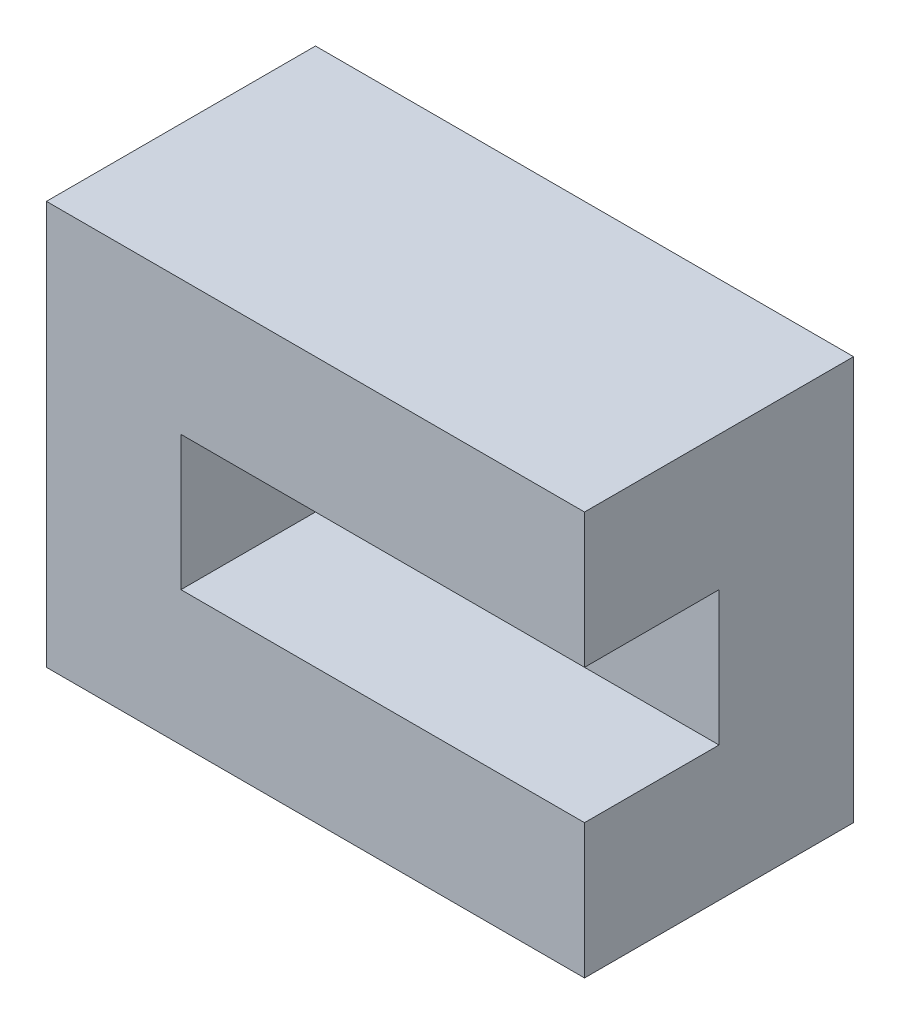
ISO-10303-21;
HEADER;
FILE_DESCRIPTION(('STEP AP214'),'2;1');
FILE_NAME('part.step','',(''),(''),'','','');
FILE_SCHEMA(('AUTOMOTIVE_DESIGN { 1 0 10303 214 1 1 1 1 }'));
ENDSEC;
DATA;
#1=APPLICATION_CONTEXT('core data for automotive mechanical design processes');
#2=APPLICATION_PROTOCOL_DEFINITION('international standard','automotive_design',2000,#1);
#3=PRODUCT_CONTEXT('',#1,'mechanical');
#4=PRODUCT('Part','Part','',(#3));
#5=PRODUCT_RELATED_PRODUCT_CATEGORY('part','',(#4));
#6=PRODUCT_DEFINITION_FORMATION('','',#4);
#7=PRODUCT_DEFINITION_CONTEXT('part definition',#1,'design');
#8=PRODUCT_DEFINITION('design','',#6,#7);
#9=PRODUCT_DEFINITION_SHAPE('','',#8);
#10=(LENGTH_UNIT() NAMED_UNIT(*) SI_UNIT(.MILLI.,.METRE.));
#11=(NAMED_UNIT(*) PLANE_ANGLE_UNIT() SI_UNIT($,.RADIAN.));
#12=(NAMED_UNIT(*) SI_UNIT($,.STERADIAN.) SOLID_ANGLE_UNIT());
#13=UNCERTAINTY_MEASURE_WITH_UNIT(LENGTH_MEASURE(1.E-05),#10,'distance_accuracy_value','');
#14=(GEOMETRIC_REPRESENTATION_CONTEXT(3) GLOBAL_UNCERTAINTY_ASSIGNED_CONTEXT((#13)) GLOBAL_UNIT_ASSIGNED_CONTEXT((#10,
#11,#12)) REPRESENTATION_CONTEXT('',''));
#15=CARTESIAN_POINT('',(0.,0.,0.));
#16=DIRECTION('',(0.,0.,1.));
#17=DIRECTION('',(1.,0.,0.));
#18=AXIS2_PLACEMENT_3D('',#15,#16,#17);
#19=CARTESIAN_POINT('',(5.22842639593908,14.5431472081218,5.));
#20=DIRECTION('',(-1.,0.,0.));
#21=DIRECTION('',(0.,0.,1.));
#22=AXIS2_PLACEMENT_3D('',#19,#20,#21);
#23=PLANE('',#22);
#24=DIRECTION('',(0.,1.,0.));
#25=VECTOR('',#24,1.);
#26=CARTESIAN_POINT('',(5.22842639593908,14.5431472081218,0.));
#27=LINE('',#26,#25);
#28=CARTESIAN_POINT('',(5.22842639593908,-0.456852791878173,0.));
#29=VERTEX_POINT('',#28);
#30=CARTESIAN_POINT('',(5.22842639593908,14.5431472081218,0.));
#31=VERTEX_POINT('',#30);
#32=EDGE_CURVE('E154',#29,#31,#27,.T.);
#33=ORIENTED_EDGE('',*,*,#32,.T.);
#34=DIRECTION('',(0.,0.,-1.));
#35=VECTOR('',#34,1.);
#36=CARTESIAN_POINT('',(5.22842639593908,14.5431472081218,5.));
#37=LINE('',#36,#35);
#38=CARTESIAN_POINT('',(5.22842639593908,14.5431472081218,10.));
#39=VERTEX_POINT('',#38);
#40=EDGE_CURVE('E11',#39,#31,#37,.T.);
#41=ORIENTED_EDGE('',*,*,#40,.F.);
#42=DIRECTION('',(0.,1.,0.));
#43=VECTOR('',#42,1.);
#44=CARTESIAN_POINT('',(5.22842639593908,9.54314720812182,10.));
#45=LINE('',#44,#43);
#46=CARTESIAN_POINT('',(5.22842639593908,9.54314720812182,10.));
#47=VERTEX_POINT('',#46);
#48=EDGE_CURVE('E135',#47,#39,#45,.T.);
#49=ORIENTED_EDGE('',*,*,#48,.F.);
#50=DIRECTION('',(0.,0.,-1.));
#51=VECTOR('',#50,1.);
#52=CARTESIAN_POINT('',(5.22842639593908,9.54314720812182,10.));
#53=LINE('',#52,#51);
#54=CARTESIAN_POINT('',(5.22842639593908,9.54314720812182,5.));
#55=VERTEX_POINT('',#54);
#56=EDGE_CURVE('E138',#47,#55,#53,.T.);
#57=ORIENTED_EDGE('',*,*,#56,.T.);
#58=DIRECTION('',(0.,1.,0.));
#59=VECTOR('',#58,1.);
#60=CARTESIAN_POINT('',(5.22842639593908,14.5431472081218,5.));
#61=LINE('',#60,#59);
#62=CARTESIAN_POINT('',(5.22842639593908,4.54314720812182,5.));
#63=VERTEX_POINT('',#62);
#64=EDGE_CURVE('E56',#63,#55,#61,.T.);
#65=ORIENTED_EDGE('',*,*,#64,.F.);
#66=DIRECTION('',(0.,0.,-1.));
#67=VECTOR('',#66,1.);
#68=CARTESIAN_POINT('',(5.22842639593908,4.54314720812182,10.));
#69=LINE('',#68,#67);
#70=CARTESIAN_POINT('',(5.22842639593908,4.54314720812182,10.));
#71=VERTEX_POINT('',#70);
#72=EDGE_CURVE('E151',#71,#63,#69,.T.);
#73=ORIENTED_EDGE('',*,*,#72,.F.);
#74=DIRECTION('',(0.,1.,0.));
#75=VECTOR('',#74,1.);
#76=CARTESIAN_POINT('',(5.22842639593908,-0.456852791878182,10.));
#77=LINE('',#76,#75);
#78=CARTESIAN_POINT('',(5.22842639593908,-0.456852791878182,10.));
#79=VERTEX_POINT('',#78);
#80=EDGE_CURVE('E117',#79,#71,#77,.T.);
#81=ORIENTED_EDGE('',*,*,#80,.F.);
#82=DIRECTION('',(0.,0.,-1.));
#83=VECTOR('',#82,1.);
#84=CARTESIAN_POINT('',(5.22842639593908,-0.456852791878173,5.));
#85=LINE('',#84,#83);
#86=EDGE_CURVE('E109',#79,#29,#85,.T.);
#87=ORIENTED_EDGE('',*,*,#86,.T.);
#88=EDGE_LOOP('',(#33,#41,#49,#57,#65,#73,#81,#87));
#89=FACE_BOUND('',#88,.T.);
#90=ADVANCED_FACE('F37',(#89),#23,.F.);
#91=CARTESIAN_POINT('',(-14.7715736040609,14.5431472081218,5.));
#92=DIRECTION('',(0.,-1.,0.));
#93=DIRECTION('',(0.,0.,-1.));
#94=AXIS2_PLACEMENT_3D('',#91,#92,#93);
#95=PLANE('',#94);
#96=DIRECTION('',(-1.,0.,0.));
#97=VECTOR('',#96,1.);
#98=CARTESIAN_POINT('',(-14.7715736040609,14.5431472081218,0.));
#99=LINE('',#98,#97);
#100=CARTESIAN_POINT('',(-14.7715736040609,14.5431472081218,0.));
#101=VERTEX_POINT('',#100);
#102=EDGE_CURVE('E159',#31,#101,#99,.T.);
#103=ORIENTED_EDGE('',*,*,#102,.T.);
#104=DIRECTION('',(0.,0.,-1.));
#105=VECTOR('',#104,1.);
#106=CARTESIAN_POINT('',(-14.7715736040609,14.5431472081218,5.));
#107=LINE('',#106,#105);
#108=CARTESIAN_POINT('',(-14.7715736040609,14.5431472081218,10.));
#109=VERTEX_POINT('',#108);
#110=EDGE_CURVE('E44',#109,#101,#107,.T.);
#111=ORIENTED_EDGE('',*,*,#110,.F.);
#112=DIRECTION('',(-1.,0.,0.));
#113=VECTOR('',#112,1.);
#114=CARTESIAN_POINT('',(5.22842639593908,14.5431472081218,10.));
#115=LINE('',#114,#113);
#116=EDGE_CURVE('E123',#39,#109,#115,.T.);
#117=ORIENTED_EDGE('',*,*,#116,.F.);
#118=ORIENTED_EDGE('',*,*,#40,.T.);
#119=EDGE_LOOP('',(#103,#111,#117,#118));
#120=FACE_BOUND('',#119,.T.);
#121=ADVANCED_FACE('F182',(#120),#95,.F.);
#122=CARTESIAN_POINT('',(-14.7715736040609,14.5431472081218,5.));
#123=DIRECTION('',(1.,0.,0.));
#124=DIRECTION('',(0.,1.,0.));
#125=AXIS2_PLACEMENT_3D('',#122,#123,#124);
#126=PLANE('',#125);
#127=DIRECTION('',(0.,-1.,0.));
#128=VECTOR('',#127,1.);
#129=CARTESIAN_POINT('',(-14.7715736040609,14.5431472081218,0.));
#130=LINE('',#129,#128);
#131=CARTESIAN_POINT('',(-14.7715736040609,-0.456852791878173,0.));
#132=VERTEX_POINT('',#131);
#133=EDGE_CURVE('E106',#101,#132,#130,.T.);
#134=ORIENTED_EDGE('',*,*,#133,.T.);
#135=DIRECTION('',(0.,0.,-1.));
#136=VECTOR('',#135,1.);
#137=CARTESIAN_POINT('',(-14.7715736040609,-0.456852791878173,5.));
#138=LINE('',#137,#136);
#139=CARTESIAN_POINT('',(-14.7715736040609,-0.456852791878182,10.));
#140=VERTEX_POINT('',#139);
#141=EDGE_CURVE('E99',#140,#132,#138,.T.);
#142=ORIENTED_EDGE('',*,*,#141,.F.);
#143=DIRECTION('',(0.,-1.,0.));
#144=VECTOR('',#143,1.);
#145=CARTESIAN_POINT('',(-14.7715736040609,14.5431472081218,10.));
#146=LINE('',#145,#144);
#147=EDGE_CURVE('E104',#109,#140,#146,.T.);
#148=ORIENTED_EDGE('',*,*,#147,.F.);
#149=ORIENTED_EDGE('',*,*,#110,.T.);
#150=EDGE_LOOP('',(#134,#142,#148,#149));
#151=FACE_BOUND('',#150,.T.);
#152=ADVANCED_FACE('F101',(#151),#126,.F.);
#153=CARTESIAN_POINT('',(-14.7715736040609,-0.456852791878173,5.));
#154=DIRECTION('',(0.,1.,0.));
#155=DIRECTION('',(0.,0.,1.));
#156=AXIS2_PLACEMENT_3D('',#153,#154,#155);
#157=PLANE('',#156);
#158=DIRECTION('',(1.,0.,0.));
#159=VECTOR('',#158,1.);
#160=CARTESIAN_POINT('',(-14.7715736040609,-0.456852791878173,0.));
#161=LINE('',#160,#159);
#162=EDGE_CURVE('E156',#132,#29,#161,.T.);
#163=ORIENTED_EDGE('',*,*,#162,.T.);
#164=ORIENTED_EDGE('',*,*,#86,.F.);
#165=DIRECTION('',(1.,0.,0.));
#166=VECTOR('',#165,1.);
#167=CARTESIAN_POINT('',(-14.7715736040609,-0.456852791878182,10.));
#168=LINE('',#167,#166);
#169=EDGE_CURVE('E112',#140,#79,#168,.T.);
#170=ORIENTED_EDGE('',*,*,#169,.F.);
#171=ORIENTED_EDGE('',*,*,#141,.T.);
#172=EDGE_LOOP('',(#163,#164,#170,#171));
#173=FACE_BOUND('',#172,.T.);
#174=ADVANCED_FACE('F113',(#173),#157,.F.);
#175=CARTESIAN_POINT('',(0.,0.,5.));
#176=DIRECTION('',(0.,0.,1.));
#177=DIRECTION('',(1.,0.,0.));
#178=AXIS2_PLACEMENT_3D('',#175,#176,#177);
#179=PLANE('',#178);
#180=DIRECTION('',(1.,0.,0.));
#181=VECTOR('',#180,1.);
#182=CARTESIAN_POINT('',(-9.77157360406091,9.54314720812182,5.));
#183=LINE('',#182,#181);
#184=CARTESIAN_POINT('',(-9.77157360406091,9.54314720812182,5.));
#185=VERTEX_POINT('',#184);
#186=EDGE_CURVE('E51',#185,#55,#183,.T.);
#187=ORIENTED_EDGE('',*,*,#186,.F.);
#188=DIRECTION('',(0.,1.,0.));
#189=VECTOR('',#188,1.);
#190=CARTESIAN_POINT('',(-9.77157360406091,4.54314720812182,5.));
#191=LINE('',#190,#189);
#192=CARTESIAN_POINT('',(-9.77157360406091,4.54314720812182,5.));
#193=VERTEX_POINT('',#192);
#194=EDGE_CURVE('E125',#193,#185,#191,.T.);
#195=ORIENTED_EDGE('',*,*,#194,.F.);
#196=DIRECTION('',(-1.,0.,0.));
#197=VECTOR('',#196,1.);
#198=CARTESIAN_POINT('',(5.22842639593908,4.54314720812182,5.));
#199=LINE('',#198,#197);
#200=EDGE_CURVE('E139',#63,#193,#199,.T.);
#201=ORIENTED_EDGE('',*,*,#200,.F.);
#202=ORIENTED_EDGE('',*,*,#64,.T.);
#203=EDGE_LOOP('',(#187,#195,#201,#202));
#204=FACE_BOUND('',#203,.T.);
#205=ADVANCED_FACE('F192',(#204),#179,.T.);
#206=CARTESIAN_POINT('',(0.,0.,0.));
#207=DIRECTION('',(0.,0.,1.));
#208=DIRECTION('',(1.,0.,0.));
#209=AXIS2_PLACEMENT_3D('',#206,#207,#208);
#210=PLANE('',#209);
#211=ORIENTED_EDGE('',*,*,#32,.F.);
#212=ORIENTED_EDGE('',*,*,#162,.F.);
#213=ORIENTED_EDGE('',*,*,#133,.F.);
#214=ORIENTED_EDGE('',*,*,#102,.F.);
#215=EDGE_LOOP('',(#211,#212,#213,#214));
#216=FACE_BOUND('',#215,.T.);
#217=ADVANCED_FACE('F166',(#216),#210,.F.);
#218=CARTESIAN_POINT('',(5.22842639593908,4.54314720812182,10.));
#219=DIRECTION('',(0.,-1.,0.));
#220=DIRECTION('',(1.,0.,0.));
#221=AXIS2_PLACEMENT_3D('',#218,#219,#220);
#222=PLANE('',#221);
#223=ORIENTED_EDGE('',*,*,#200,.T.);
#224=DIRECTION('',(0.,0.,-1.));
#225=VECTOR('',#224,1.);
#226=CARTESIAN_POINT('',(-9.77157360406091,4.54314720812182,10.));
#227=LINE('',#226,#225);
#228=CARTESIAN_POINT('',(-9.77157360406091,4.54314720812182,10.));
#229=VERTEX_POINT('',#228);
#230=EDGE_CURVE('E148',#229,#193,#227,.T.);
#231=ORIENTED_EDGE('',*,*,#230,.F.);
#232=DIRECTION('',(-1.,0.,0.));
#233=VECTOR('',#232,1.);
#234=CARTESIAN_POINT('',(5.22842639593908,4.54314720812182,10.));
#235=LINE('',#234,#233);
#236=EDGE_CURVE('E129',#71,#229,#235,.T.);
#237=ORIENTED_EDGE('',*,*,#236,.F.);
#238=ORIENTED_EDGE('',*,*,#72,.T.);
#239=EDGE_LOOP('',(#223,#231,#237,#238));
#240=FACE_BOUND('',#239,.T.);
#241=ADVANCED_FACE('F174',(#240),#222,.F.);
#242=CARTESIAN_POINT('',(-9.77157360406091,4.54314720812182,10.));
#243=DIRECTION('',(-1.,0.,0.));
#244=DIRECTION('',(0.,0.,1.));
#245=AXIS2_PLACEMENT_3D('',#242,#243,#244);
#246=PLANE('',#245);
#247=ORIENTED_EDGE('',*,*,#194,.T.);
#248=DIRECTION('',(0.,0.,-1.));
#249=VECTOR('',#248,1.);
#250=CARTESIAN_POINT('',(-9.77157360406091,9.54314720812182,10.));
#251=LINE('',#250,#249);
#252=CARTESIAN_POINT('',(-9.77157360406091,9.54314720812182,10.));
#253=VERTEX_POINT('',#252);
#254=EDGE_CURVE('E145',#253,#185,#251,.T.);
#255=ORIENTED_EDGE('',*,*,#254,.F.);
#256=DIRECTION('',(0.,1.,0.));
#257=VECTOR('',#256,1.);
#258=CARTESIAN_POINT('',(-9.77157360406091,4.54314720812182,10.));
#259=LINE('',#258,#257);
#260=EDGE_CURVE('E131',#229,#253,#259,.T.);
#261=ORIENTED_EDGE('',*,*,#260,.F.);
#262=ORIENTED_EDGE('',*,*,#230,.T.);
#263=EDGE_LOOP('',(#247,#255,#261,#262));
#264=FACE_BOUND('',#263,.T.);
#265=ADVANCED_FACE('F176',(#264),#246,.F.);
#266=CARTESIAN_POINT('',(-9.77157360406091,9.54314720812182,10.));
#267=DIRECTION('',(0.,1.,0.));
#268=DIRECTION('',(-1.,0.,0.));
#269=AXIS2_PLACEMENT_3D('',#266,#267,#268);
#270=PLANE('',#269);
#271=ORIENTED_EDGE('',*,*,#186,.T.);
#272=ORIENTED_EDGE('',*,*,#56,.F.);
#273=DIRECTION('',(1.,0.,0.));
#274=VECTOR('',#273,1.);
#275=CARTESIAN_POINT('',(-9.77157360406091,9.54314720812182,10.));
#276=LINE('',#275,#274);
#277=EDGE_CURVE('E133',#253,#47,#276,.T.);
#278=ORIENTED_EDGE('',*,*,#277,.F.);
#279=ORIENTED_EDGE('',*,*,#254,.T.);
#280=EDGE_LOOP('',(#271,#272,#278,#279));
#281=FACE_BOUND('',#280,.T.);
#282=ADVANCED_FACE('F180',(#281),#270,.F.);
#283=CARTESIAN_POINT('',(0.,0.,10.));
#284=DIRECTION('',(0.,0.,1.));
#285=DIRECTION('',(1.,0.,0.));
#286=AXIS2_PLACEMENT_3D('',#283,#284,#285);
#287=PLANE('',#286);
#288=ORIENTED_EDGE('',*,*,#147,.T.);
#289=ORIENTED_EDGE('',*,*,#169,.T.);
#290=ORIENTED_EDGE('',*,*,#80,.T.);
#291=ORIENTED_EDGE('',*,*,#236,.T.);
#292=ORIENTED_EDGE('',*,*,#260,.T.);
#293=ORIENTED_EDGE('',*,*,#277,.T.);
#294=ORIENTED_EDGE('',*,*,#48,.T.);
#295=ORIENTED_EDGE('',*,*,#116,.T.);
#296=EDGE_LOOP('',(#288,#289,#290,#291,#292,#293,#294,#295));
#297=FACE_BOUND('',#296,.T.);
#298=ADVANCED_FACE('F120',(#297),#287,.T.);
#299=CLOSED_SHELL('',(#90,#121,#152,#174,#205,#217,#241,#265,#282,#298));
#300=MANIFOLD_SOLID_BREP('B2',#299);
#301=ADVANCED_BREP_SHAPE_REPRESENTATION('',(#18,#300),#14);
#302=SHAPE_DEFINITION_REPRESENTATION(#9,#301);
ENDSEC;
END-ISO-10303-21;
